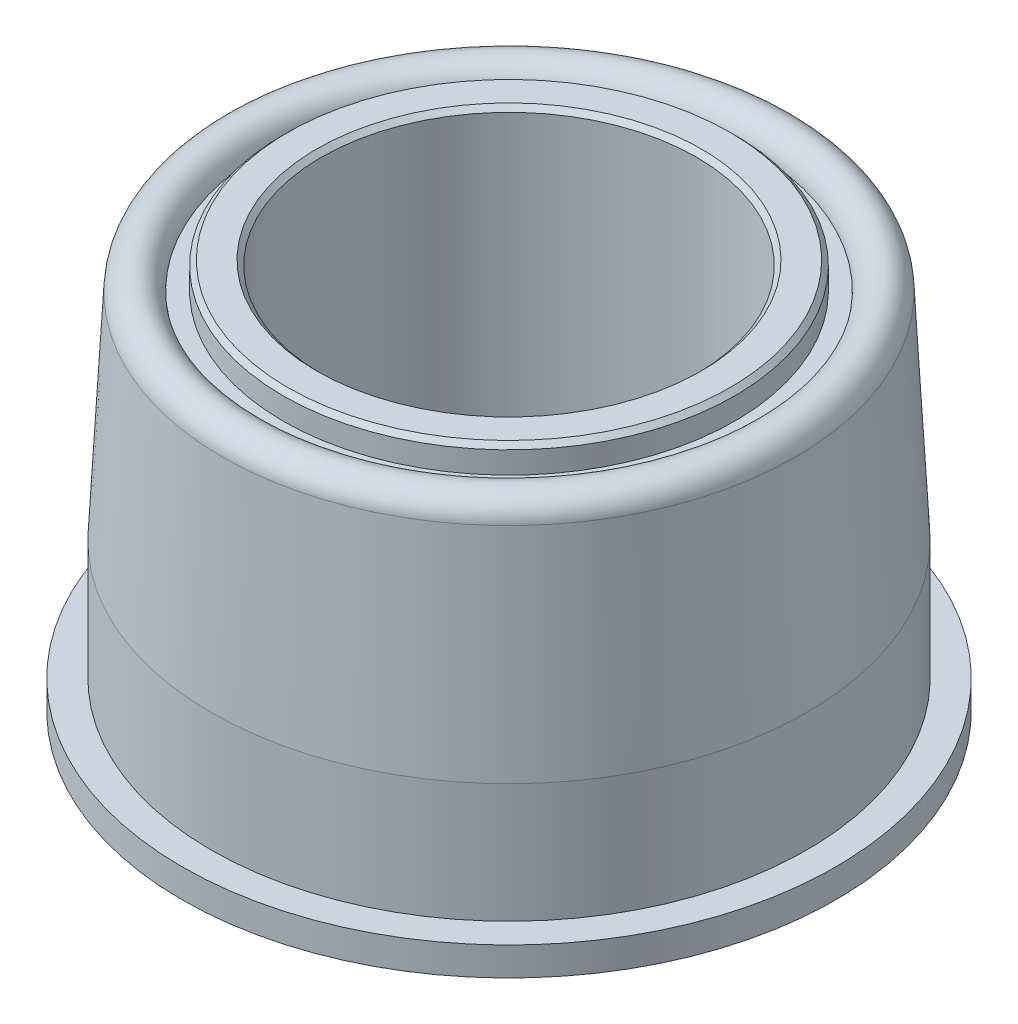
ISO-10303-21;
HEADER;
FILE_DESCRIPTION(('STEP AP214'),'2;1');
FILE_NAME('part.step','',(''),(''),'','','');
FILE_SCHEMA(('AUTOMOTIVE_DESIGN { 1 0 10303 214 1 1 1 1 }'));
ENDSEC;
DATA;
#1=APPLICATION_CONTEXT('core data for automotive mechanical design processes');
#2=APPLICATION_PROTOCOL_DEFINITION('international standard','automotive_design',2000,#1);
#3=PRODUCT_CONTEXT('',#1,'mechanical');
#4=PRODUCT('Part','Part','',(#3));
#5=PRODUCT_RELATED_PRODUCT_CATEGORY('part','',(#4));
#6=PRODUCT_DEFINITION_FORMATION('','',#4);
#7=PRODUCT_DEFINITION_CONTEXT('part definition',#1,'design');
#8=PRODUCT_DEFINITION('design','',#6,#7);
#9=PRODUCT_DEFINITION_SHAPE('','',#8);
#10=(LENGTH_UNIT() NAMED_UNIT(*) SI_UNIT(.MILLI.,.METRE.));
#11=(NAMED_UNIT(*) PLANE_ANGLE_UNIT() SI_UNIT($,.RADIAN.));
#12=(NAMED_UNIT(*) SI_UNIT($,.STERADIAN.) SOLID_ANGLE_UNIT());
#13=UNCERTAINTY_MEASURE_WITH_UNIT(LENGTH_MEASURE(1.E-05),#10,'distance_accuracy_value','');
#14=(GEOMETRIC_REPRESENTATION_CONTEXT(3) GLOBAL_UNCERTAINTY_ASSIGNED_CONTEXT((#13)) GLOBAL_UNIT_ASSIGNED_CONTEXT((#10,
#11,#12)) REPRESENTATION_CONTEXT('',''));
#15=CARTESIAN_POINT('',(0.,0.,0.));
#16=DIRECTION('',(0.,0.,1.));
#17=DIRECTION('',(1.,0.,0.));
#18=AXIS2_PLACEMENT_3D('',#15,#16,#17);
#19=CARTESIAN_POINT('',(-6.4008,0.380999999999999,0.));
#20=DIRECTION('',(0.,-1.,0.));
#21=DIRECTION('',(0.,0.,-1.));
#22=AXIS2_PLACEMENT_3D('',#19,#20,#21);
#23=PLANE('',#22);
#24=CARTESIAN_POINT('',(0.,0.380999999999999,0.));
#25=DIRECTION('',(0.,-1.,0.));
#26=DIRECTION('',(0.,0.,-1.));
#27=AXIS2_PLACEMENT_3D('',#24,#25,#26);
#28=CIRCLE('',#27,6.52779999999999);
#29=CARTESIAN_POINT('',(0.,0.380999999999999,-6.52779999999999));
#30=VERTEX_POINT('',#29);
#31=EDGE_CURVE('E68',#30,#30,#28,.F.);
#32=ORIENTED_EDGE('',*,*,#31,.T.);
#33=EDGE_LOOP('',(#32));
#34=FACE_BOUND('',#33,.T.);
#35=CARTESIAN_POINT('',(0.,0.380999999999999,0.));
#36=DIRECTION('',(0.,1.,0.));
#37=DIRECTION('',(0.,0.,1.));
#38=AXIS2_PLACEMENT_3D('',#35,#36,#37);
#39=CIRCLE('',#38,8.7122);
#40=CARTESIAN_POINT('',(0.,0.380999999999999,8.7122));
#41=VERTEX_POINT('',#40);
#42=EDGE_CURVE('E71',#41,#41,#39,.T.);
#43=ORIENTED_EDGE('',*,*,#42,.F.);
#44=EDGE_LOOP('',(#43));
#45=FACE_BOUND('',#44,.T.);
#46=ADVANCED_FACE('F33',(#34,#45),#23,.T.);
#47=CARTESIAN_POINT('',(0.,15.2814888555423,0.));
#48=DIRECTION('',(0.,1.,0.));
#49=DIRECTION('',(0.,0.,1.));
#50=AXIS2_PLACEMENT_3D('',#47,#48,#49);
#51=CYLINDRICAL_SURFACE('',#50,8.7122);
#52=ORIENTED_EDGE('',*,*,#42,.T.);
#53=EDGE_LOOP('',(#52));
#54=FACE_BOUND('',#53,.T.);
#55=CARTESIAN_POINT('',(0.,1.143,0.));
#56=DIRECTION('',(0.,1.,0.));
#57=DIRECTION('',(0.,0.,1.));
#58=AXIS2_PLACEMENT_3D('',#55,#56,#57);
#59=CIRCLE('',#58,8.7122);
#60=CARTESIAN_POINT('',(0.,1.143,8.7122));
#61=VERTEX_POINT('',#60);
#62=EDGE_CURVE('E74',#61,#61,#59,.T.);
#63=ORIENTED_EDGE('',*,*,#62,.F.);
#64=EDGE_LOOP('',(#63));
#65=FACE_BOUND('',#64,.T.);
#66=ADVANCED_FACE('F117',(#54,#65),#51,.T.);
#67=CARTESIAN_POINT('',(-8.7122,1.143,0.));
#68=DIRECTION('',(0.,1.,0.));
#69=DIRECTION('',(0.,0.,1.));
#70=AXIS2_PLACEMENT_3D('',#67,#68,#69);
#71=PLANE('',#70);
#72=ORIENTED_EDGE('',*,*,#62,.T.);
#73=EDGE_LOOP('',(#72));
#74=FACE_BOUND('',#73,.T.);
#75=CARTESIAN_POINT('',(0.,1.143,0.));
#76=DIRECTION('',(0.,1.,0.));
#77=DIRECTION('',(0.,0.,1.));
#78=AXIS2_PLACEMENT_3D('',#75,#76,#77);
#79=CIRCLE('',#78,7.9375);
#80=CARTESIAN_POINT('',(0.,1.143,7.9375));
#81=VERTEX_POINT('',#80);
#82=EDGE_CURVE('E77',#81,#81,#79,.T.);
#83=ORIENTED_EDGE('',*,*,#82,.F.);
#84=EDGE_LOOP('',(#83));
#85=FACE_BOUND('',#84,.T.);
#86=ADVANCED_FACE('F123',(#74,#85),#71,.T.);
#87=CARTESIAN_POINT('',(0.,15.2814888555423,0.));
#88=DIRECTION('',(0.,1.,0.));
#89=DIRECTION('',(0.,0.,1.));
#90=AXIS2_PLACEMENT_3D('',#87,#88,#89);
#91=CYLINDRICAL_SURFACE('',#90,7.9375);
#92=ORIENTED_EDGE('',*,*,#82,.T.);
#93=EDGE_LOOP('',(#92));
#94=FACE_BOUND('',#93,.T.);
#95=CARTESIAN_POINT('',(0.,4.318,0.));
#96=DIRECTION('',(0.,1.,0.));
#97=DIRECTION('',(0.,0.,1.));
#98=AXIS2_PLACEMENT_3D('',#95,#96,#97);
#99=CIRCLE('',#98,7.9375);
#100=CARTESIAN_POINT('',(0.,4.318,7.9375));
#101=VERTEX_POINT('',#100);
#102=EDGE_CURVE('E80',#101,#101,#99,.T.);
#103=ORIENTED_EDGE('',*,*,#102,.F.);
#104=EDGE_LOOP('',(#103));
#105=FACE_BOUND('',#104,.T.);
#106=ADVANCED_FACE('F176',(#94,#105),#91,.T.);
#107=CARTESIAN_POINT('',(0.,10.0635746656371,0.));
#108=DIRECTION('',(0.,-1.,0.));
#109=DIRECTION('',(0.,0.,-1.));
#110=AXIS2_PLACEMENT_3D('',#107,#108,#109);
#111=CONICAL_SURFACE('',#110,7.63638719106905,0.0523598775598301);
#112=ORIENTED_EDGE('',*,*,#102,.T.);
#113=EDGE_LOOP('',(#112));
#114=FACE_BOUND('',#113,.T.);
#115=CARTESIAN_POINT('',(0.,10.0635746656371,0.));
#116=DIRECTION('',(0.,1.,0.));
#117=DIRECTION('',(0.,0.,1.));
#118=AXIS2_PLACEMENT_3D('',#115,#116,#117);
#119=CIRCLE('',#118,7.63638719106905);
#120=CARTESIAN_POINT('',(0.,10.0635746656371,7.63638719106905));
#121=VERTEX_POINT('',#120);
#122=EDGE_CURVE('E83',#121,#121,#119,.T.);
#123=ORIENTED_EDGE('',*,*,#122,.F.);
#124=EDGE_LOOP('',(#123));
#125=FACE_BOUND('',#124,.T.);
#126=ADVANCED_FACE('F172',(#114,#125),#111,.T.);
#127=CARTESIAN_POINT('',(0.,10.033,0.));
#128=DIRECTION('',(0.,1.,0.));
#129=DIRECTION('',(0.,0.,1.));
#130=AXIS2_PLACEMENT_3D('',#127,#128,#129);
#131=TOROIDAL_SURFACE('',#130,7.05298781686543,0.5842);
#132=ORIENTED_EDGE('',*,*,#122,.T.);
#133=EDGE_LOOP('',(#132));
#134=FACE_BOUND('',#133,.T.);
#135=CARTESIAN_POINT('',(0.,10.0838,0.));
#136=DIRECTION('',(0.,1.,0.));
#137=DIRECTION('',(0.,0.,1.));
#138=AXIS2_PLACEMENT_3D('',#135,#136,#137);
#139=CIRCLE('',#138,6.47100070360604);
#140=CARTESIAN_POINT('',(0.,10.0838,6.47100070360604));
#141=VERTEX_POINT('',#140);
#142=EDGE_CURVE('E86',#141,#141,#139,.T.);
#143=ORIENTED_EDGE('',*,*,#142,.F.);
#144=EDGE_LOOP('',(#143));
#145=FACE_BOUND('',#144,.T.);
#146=ADVANCED_FACE('F168',(#134,#145),#131,.T.);
#147=CARTESIAN_POINT('',(-6.47100070360604,10.0838,0.));
#148=DIRECTION('',(0.,1.,0.));
#149=DIRECTION('',(0.,0.,1.));
#150=AXIS2_PLACEMENT_3D('',#147,#148,#149);
#151=PLANE('',#150);
#152=ORIENTED_EDGE('',*,*,#142,.T.);
#153=EDGE_LOOP('',(#152));
#154=FACE_BOUND('',#153,.T.);
#155=CARTESIAN_POINT('',(0.,10.0838,0.));
#156=DIRECTION('',(0.,1.,0.));
#157=DIRECTION('',(0.,0.,1.));
#158=AXIS2_PLACEMENT_3D('',#155,#156,#157);
#159=CIRCLE('',#158,6.0198);
#160=CARTESIAN_POINT('',(0.,10.0838,6.0198));
#161=VERTEX_POINT('',#160);
#162=EDGE_CURVE('E89',#161,#161,#159,.T.);
#163=ORIENTED_EDGE('',*,*,#162,.F.);
#164=EDGE_LOOP('',(#163));
#165=FACE_BOUND('',#164,.T.);
#166=ADVANCED_FACE('F165',(#154,#165),#151,.T.);
#167=CARTESIAN_POINT('',(0.,15.2814888555423,0.));
#168=DIRECTION('',(0.,1.,0.));
#169=DIRECTION('',(0.,0.,1.));
#170=AXIS2_PLACEMENT_3D('',#167,#168,#169);
#171=CYLINDRICAL_SURFACE('',#170,6.0198);
#172=CARTESIAN_POINT('',(0.,10.668,0.));
#173=DIRECTION('',(0.,1.,0.));
#174=DIRECTION('',(0.,0.,1.));
#175=AXIS2_PLACEMENT_3D('',#172,#173,#174);
#176=CIRCLE('',#175,6.0198);
#177=CARTESIAN_POINT('',(0.,10.668,6.0198));
#178=VERTEX_POINT('',#177);
#179=EDGE_CURVE('E10',#178,#178,#176,.F.);
#180=ORIENTED_EDGE('',*,*,#179,.T.);
#181=EDGE_LOOP('',(#180));
#182=FACE_BOUND('',#181,.T.);
#183=ORIENTED_EDGE('',*,*,#162,.T.);
#184=EDGE_LOOP('',(#183));
#185=FACE_BOUND('',#184,.T.);
#186=ADVANCED_FACE('F160',(#182,#185),#171,.T.);
#187=CARTESIAN_POINT('',(-6.0198,10.795,0.));
#188=DIRECTION('',(0.,1.,0.));
#189=DIRECTION('',(0.,0.,1.));
#190=AXIS2_PLACEMENT_3D('',#187,#188,#189);
#191=PLANE('',#190);
#192=CARTESIAN_POINT('',(0.,10.795,0.));
#193=DIRECTION('',(0.,1.,0.));
#194=DIRECTION('',(0.,0.,1.));
#195=AXIS2_PLACEMENT_3D('',#192,#193,#194);
#196=CIRCLE('',#195,5.127);
#197=CARTESIAN_POINT('',(0.,10.795,5.127));
#198=VERTEX_POINT('',#197);
#199=EDGE_CURVE('E40',#198,#198,#196,.F.);
#200=ORIENTED_EDGE('',*,*,#199,.T.);
#201=EDGE_LOOP('',(#200));
#202=FACE_BOUND('',#201,.T.);
#203=CARTESIAN_POINT('',(0.,10.795,0.));
#204=DIRECTION('',(0.,1.,0.));
#205=DIRECTION('',(0.,0.,1.));
#206=AXIS2_PLACEMENT_3D('',#203,#204,#205);
#207=CIRCLE('',#206,5.8928);
#208=CARTESIAN_POINT('',(0.,10.795,5.8928));
#209=VERTEX_POINT('',#208);
#210=EDGE_CURVE('E44',#209,#209,#207,.T.);
#211=ORIENTED_EDGE('',*,*,#210,.T.);
#212=EDGE_LOOP('',(#211));
#213=FACE_BOUND('',#212,.T.);
#214=ADVANCED_FACE('F151',(#202,#213),#191,.T.);
#215=CARTESIAN_POINT('',(0.,15.2814888555423,0.));
#216=DIRECTION('',(0.,1.,0.));
#217=DIRECTION('',(0.,0.,1.));
#218=AXIS2_PLACEMENT_3D('',#215,#216,#217);
#219=CYLINDRICAL_SURFACE('',#218,5.);
#220=CARTESIAN_POINT('',(0.,0.126999999999999,0.));
#221=DIRECTION('',(0.,-1.,0.));
#222=DIRECTION('',(0.,0.,-1.));
#223=AXIS2_PLACEMENT_3D('',#220,#221,#222);
#224=CIRCLE('',#223,5.);
#225=CARTESIAN_POINT('',(0.,0.126999999999999,-5.));
#226=VERTEX_POINT('',#225);
#227=EDGE_CURVE('E48',#226,#226,#224,.T.);
#228=ORIENTED_EDGE('',*,*,#227,.T.);
#229=EDGE_LOOP('',(#228));
#230=FACE_BOUND('',#229,.T.);
#231=CARTESIAN_POINT('',(0.,10.668,0.));
#232=DIRECTION('',(0.,1.,0.));
#233=DIRECTION('',(0.,0.,1.));
#234=AXIS2_PLACEMENT_3D('',#231,#232,#233);
#235=CIRCLE('',#234,5.);
#236=CARTESIAN_POINT('',(0.,10.668,5.));
#237=VERTEX_POINT('',#236);
#238=EDGE_CURVE('E53',#237,#237,#235,.T.);
#239=ORIENTED_EDGE('',*,*,#238,.T.);
#240=EDGE_LOOP('',(#239));
#241=FACE_BOUND('',#240,.T.);
#242=ADVANCED_FACE('F149',(#230,#241),#219,.F.);
#243=CARTESIAN_POINT('',(-5.,0.,0.));
#244=DIRECTION('',(0.,-1.,0.));
#245=DIRECTION('',(0.,0.,-1.));
#246=AXIS2_PLACEMENT_3D('',#243,#244,#245);
#247=PLANE('',#246);
#248=CARTESIAN_POINT('',(0.,0.,0.));
#249=DIRECTION('',(0.,-1.,0.));
#250=DIRECTION('',(0.,0.,-1.));
#251=AXIS2_PLACEMENT_3D('',#248,#249,#250);
#252=CIRCLE('',#251,5.8928);
#253=CARTESIAN_POINT('',(0.,0.,-5.8928));
#254=VERTEX_POINT('',#253);
#255=EDGE_CURVE('E56',#254,#254,#252,.T.);
#256=ORIENTED_EDGE('',*,*,#255,.T.);
#257=EDGE_LOOP('',(#256));
#258=FACE_BOUND('',#257,.T.);
#259=CARTESIAN_POINT('',(0.,0.,0.));
#260=DIRECTION('',(0.,-1.,0.));
#261=DIRECTION('',(0.,0.,-1.));
#262=AXIS2_PLACEMENT_3D('',#259,#260,#261);
#263=CIRCLE('',#262,5.127);
#264=CARTESIAN_POINT('',(0.,0.,-5.127));
#265=VERTEX_POINT('',#264);
#266=EDGE_CURVE('E59',#265,#265,#263,.F.);
#267=ORIENTED_EDGE('',*,*,#266,.T.);
#268=EDGE_LOOP('',(#267));
#269=FACE_BOUND('',#268,.T.);
#270=ADVANCED_FACE('F113',(#258,#269),#247,.T.);
#271=CARTESIAN_POINT('',(0.,15.2814888555423,0.));
#272=DIRECTION('',(0.,1.,0.));
#273=DIRECTION('',(0.,0.,1.));
#274=AXIS2_PLACEMENT_3D('',#271,#272,#273);
#275=CYLINDRICAL_SURFACE('',#274,6.0198);
#276=CARTESIAN_POINT('',(0.,0.126999999999999,0.));
#277=DIRECTION('',(0.,-1.,0.));
#278=DIRECTION('',(0.,0.,-1.));
#279=AXIS2_PLACEMENT_3D('',#276,#277,#278);
#280=CIRCLE('',#279,6.0198);
#281=CARTESIAN_POINT('',(0.,0.126999999999999,-6.0198));
#282=VERTEX_POINT('',#281);
#283=EDGE_CURVE('E62',#282,#282,#280,.F.);
#284=ORIENTED_EDGE('',*,*,#283,.T.);
#285=EDGE_LOOP('',(#284));
#286=FACE_BOUND('',#285,.T.);
#287=CARTESIAN_POINT('',(0.,1.651,0.));
#288=DIRECTION('',(0.,1.,0.));
#289=DIRECTION('',(0.,0.,1.));
#290=AXIS2_PLACEMENT_3D('',#287,#288,#289);
#291=CIRCLE('',#290,6.0198);
#292=CARTESIAN_POINT('',(0.,1.651,6.0198));
#293=VERTEX_POINT('',#292);
#294=EDGE_CURVE('E92',#293,#293,#291,.T.);
#295=ORIENTED_EDGE('',*,*,#294,.F.);
#296=EDGE_LOOP('',(#295));
#297=FACE_BOUND('',#296,.T.);
#298=ADVANCED_FACE('F103',(#286,#297),#275,.T.);
#299=CARTESIAN_POINT('',(-6.0198,1.651,0.));
#300=DIRECTION('',(0.,-1.,0.));
#301=DIRECTION('',(0.,0.,-1.));
#302=AXIS2_PLACEMENT_3D('',#299,#300,#301);
#303=PLANE('',#302);
#304=ORIENTED_EDGE('',*,*,#294,.T.);
#305=EDGE_LOOP('',(#304));
#306=FACE_BOUND('',#305,.T.);
#307=CARTESIAN_POINT('',(0.,1.651,0.));
#308=DIRECTION('',(0.,1.,0.));
#309=DIRECTION('',(0.,0.,1.));
#310=AXIS2_PLACEMENT_3D('',#307,#308,#309);
#311=CIRCLE('',#310,6.4008);
#312=CARTESIAN_POINT('',(0.,1.651,6.4008));
#313=VERTEX_POINT('',#312);
#314=EDGE_CURVE('E95',#313,#313,#311,.T.);
#315=ORIENTED_EDGE('',*,*,#314,.F.);
#316=EDGE_LOOP('',(#315));
#317=FACE_BOUND('',#316,.T.);
#318=ADVANCED_FACE('F101',(#306,#317),#303,.T.);
#319=CARTESIAN_POINT('',(0.,15.2814888555423,0.));
#320=DIRECTION('',(0.,1.,0.));
#321=DIRECTION('',(0.,0.,1.));
#322=AXIS2_PLACEMENT_3D('',#319,#320,#321);
#323=CYLINDRICAL_SURFACE('',#322,6.4008);
#324=CARTESIAN_POINT('',(0.,0.507999999999998,0.));
#325=DIRECTION('',(0.,-1.,0.));
#326=DIRECTION('',(0.,0.,-1.));
#327=AXIS2_PLACEMENT_3D('',#324,#325,#326);
#328=CIRCLE('',#327,6.4008);
#329=CARTESIAN_POINT('',(0.,0.507999999999998,-6.4008));
#330=VERTEX_POINT('',#329);
#331=EDGE_CURVE('E65',#330,#330,#328,.T.);
#332=ORIENTED_EDGE('',*,*,#331,.T.);
#333=EDGE_LOOP('',(#332));
#334=FACE_BOUND('',#333,.T.);
#335=ORIENTED_EDGE('',*,*,#314,.T.);
#336=EDGE_LOOP('',(#335));
#337=FACE_BOUND('',#336,.T.);
#338=ADVANCED_FACE('F99',(#334,#337),#323,.F.);
#339=CARTESIAN_POINT('',(0.,0.380999999999999,0.));
#340=DIRECTION('',(0.,-1.,0.));
#341=DIRECTION('',(0.,0.,-1.));
#342=AXIS2_PLACEMENT_3D('',#339,#340,#341);
#343=CONICAL_SURFACE('',#342,6.52779999999999,0.785398163397435);
#344=ORIENTED_EDGE('',*,*,#331,.F.);
#345=EDGE_LOOP('',(#344));
#346=FACE_BOUND('',#345,.T.);
#347=ORIENTED_EDGE('',*,*,#31,.F.);
#348=EDGE_LOOP('',(#347));
#349=FACE_BOUND('',#348,.T.);
#350=ADVANCED_FACE('F110',(#346,#349),#343,.F.);
#351=CARTESIAN_POINT('',(0.,0.126999999999999,0.));
#352=DIRECTION('',(0.,1.,0.));
#353=DIRECTION('',(0.,0.,1.));
#354=AXIS2_PLACEMENT_3D('',#351,#352,#353);
#355=CONICAL_SURFACE('',#354,6.0198,0.785398163397448);
#356=ORIENTED_EDGE('',*,*,#255,.F.);
#357=EDGE_LOOP('',(#356));
#358=FACE_BOUND('',#357,.T.);
#359=ORIENTED_EDGE('',*,*,#283,.F.);
#360=EDGE_LOOP('',(#359));
#361=FACE_BOUND('',#360,.T.);
#362=ADVANCED_FACE('F131',(#358,#361),#355,.T.);
#363=CARTESIAN_POINT('',(0.,0.,0.));
#364=DIRECTION('',(0.,-1.,0.));
#365=DIRECTION('',(0.,0.,-1.));
#366=AXIS2_PLACEMENT_3D('',#363,#364,#365);
#367=CONICAL_SURFACE('',#366,5.12699999999999,0.785398163397438);
#368=ORIENTED_EDGE('',*,*,#227,.F.);
#369=EDGE_LOOP('',(#368));
#370=FACE_BOUND('',#369,.T.);
#371=ORIENTED_EDGE('',*,*,#266,.F.);
#372=EDGE_LOOP('',(#371));
#373=FACE_BOUND('',#372,.T.);
#374=ADVANCED_FACE('F135',(#370,#373),#367,.F.);
#375=CARTESIAN_POINT('',(0.,10.668,0.));
#376=DIRECTION('',(0.,1.,0.));
#377=DIRECTION('',(0.,0.,1.));
#378=AXIS2_PLACEMENT_3D('',#375,#376,#377);
#379=CONICAL_SURFACE('',#378,5.,0.785398163397431);
#380=ORIENTED_EDGE('',*,*,#199,.F.);
#381=EDGE_LOOP('',(#380));
#382=FACE_BOUND('',#381,.T.);
#383=ORIENTED_EDGE('',*,*,#238,.F.);
#384=EDGE_LOOP('',(#383));
#385=FACE_BOUND('',#384,.T.);
#386=ADVANCED_FACE('F138',(#382,#385),#379,.F.);
#387=CARTESIAN_POINT('',(0.,10.795,0.));
#388=DIRECTION('',(0.,-1.,0.));
#389=DIRECTION('',(0.,0.,-1.));
#390=AXIS2_PLACEMENT_3D('',#387,#388,#389);
#391=CONICAL_SURFACE('',#390,5.8928,0.785398163397421);
#392=ORIENTED_EDGE('',*,*,#179,.F.);
#393=EDGE_LOOP('',(#392));
#394=FACE_BOUND('',#393,.T.);
#395=ORIENTED_EDGE('',*,*,#210,.F.);
#396=EDGE_LOOP('',(#395));
#397=FACE_BOUND('',#396,.T.);
#398=ADVANCED_FACE('F35',(#394,#397),#391,.T.);
#399=CLOSED_SHELL('',(#46,#66,#86,#106,#126,#146,#166,#186,#214,#242,#270,#298,#318,#338,#350,
#362,#374,#386,#398));
#400=MANIFOLD_SOLID_BREP('B2',#399);
#401=ADVANCED_BREP_SHAPE_REPRESENTATION('',(#18,#400),#14);
#402=SHAPE_DEFINITION_REPRESENTATION(#9,#401);
ENDSEC;
END-ISO-10303-21;
